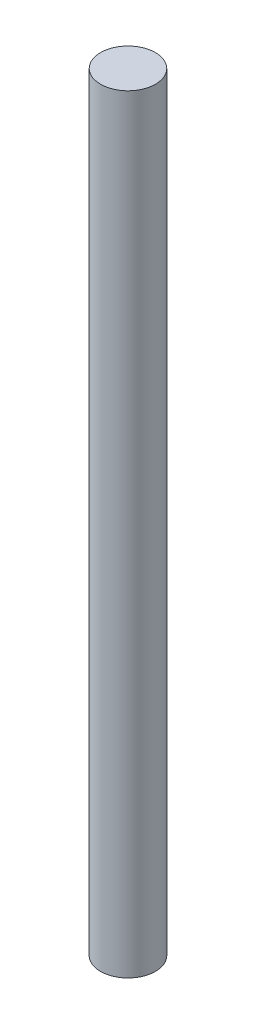
ISO-10303-21;
HEADER;
FILE_DESCRIPTION(('STEP AP214'),'2;1');
FILE_NAME('part.step','',(''),(''),'','','');
FILE_SCHEMA(('AUTOMOTIVE_DESIGN { 1 0 10303 214 1 1 1 1 }'));
ENDSEC;
DATA;
#1=APPLICATION_CONTEXT('core data for automotive mechanical design processes');
#2=APPLICATION_PROTOCOL_DEFINITION('international standard','automotive_design',2000,#1);
#3=PRODUCT_CONTEXT('',#1,'mechanical');
#4=PRODUCT('Part','Part','',(#3));
#5=PRODUCT_RELATED_PRODUCT_CATEGORY('part','',(#4));
#6=PRODUCT_DEFINITION_FORMATION('','',#4);
#7=PRODUCT_DEFINITION_CONTEXT('part definition',#1,'design');
#8=PRODUCT_DEFINITION('design','',#6,#7);
#9=PRODUCT_DEFINITION_SHAPE('','',#8);
#10=(LENGTH_UNIT() NAMED_UNIT(*) SI_UNIT(.MILLI.,.METRE.));
#11=(NAMED_UNIT(*) PLANE_ANGLE_UNIT() SI_UNIT($,.RADIAN.));
#12=(NAMED_UNIT(*) SI_UNIT($,.STERADIAN.) SOLID_ANGLE_UNIT());
#13=UNCERTAINTY_MEASURE_WITH_UNIT(LENGTH_MEASURE(1.E-05),#10,'distance_accuracy_value','');
#14=(GEOMETRIC_REPRESENTATION_CONTEXT(3) GLOBAL_UNCERTAINTY_ASSIGNED_CONTEXT((#13)) GLOBAL_UNIT_ASSIGNED_CONTEXT((#10,
#11,#12)) REPRESENTATION_CONTEXT('',''));
#15=CARTESIAN_POINT('',(0.,0.,0.));
#16=DIRECTION('',(0.,0.,1.));
#17=DIRECTION('',(1.,0.,0.));
#18=AXIS2_PLACEMENT_3D('',#15,#16,#17);
#19=CARTESIAN_POINT('',(0.,44.45,0.));
#20=DIRECTION('',(0.,-1.,0.));
#21=DIRECTION('',(0.,0.,-1.));
#22=AXIS2_PLACEMENT_3D('',#19,#20,#21);
#23=CYLINDRICAL_SURFACE('',#22,1.5875);
#24=CARTESIAN_POINT('',(0.,44.45,0.));
#25=DIRECTION('',(0.,1.,0.));
#26=DIRECTION('',(0.,0.,1.));
#27=AXIS2_PLACEMENT_3D('',#24,#25,#26);
#28=CIRCLE('',#27,1.5875);
#29=CARTESIAN_POINT('',(0.,44.45,1.5875));
#30=VERTEX_POINT('',#29);
#31=EDGE_CURVE('E10',#30,#30,#28,.T.);
#32=ORIENTED_EDGE('',*,*,#31,.F.);
#33=EDGE_LOOP('',(#32));
#34=FACE_BOUND('',#33,.T.);
#35=CARTESIAN_POINT('',(0.,0.,0.));
#36=DIRECTION('',(0.,1.,0.));
#37=DIRECTION('',(0.,0.,1.));
#38=AXIS2_PLACEMENT_3D('',#35,#36,#37);
#39=CIRCLE('',#38,1.5875);
#40=CARTESIAN_POINT('',(0.,0.,1.5875));
#41=VERTEX_POINT('',#40);
#42=EDGE_CURVE('E38',#41,#41,#39,.T.);
#43=ORIENTED_EDGE('',*,*,#42,.T.);
#44=EDGE_LOOP('',(#43));
#45=FACE_BOUND('',#44,.T.);
#46=ADVANCED_FACE('F35',(#34,#45),#23,.T.);
#47=CARTESIAN_POINT('',(0.,44.45,0.));
#48=DIRECTION('',(0.,1.,0.));
#49=DIRECTION('',(0.,0.,1.));
#50=AXIS2_PLACEMENT_3D('',#47,#48,#49);
#51=PLANE('',#50);
#52=ORIENTED_EDGE('',*,*,#31,.T.);
#53=EDGE_LOOP('',(#52));
#54=FACE_BOUND('',#53,.T.);
#55=ADVANCED_FACE('F50',(#54),#51,.T.);
#56=CARTESIAN_POINT('',(0.,0.,0.));
#57=DIRECTION('',(0.,1.,0.));
#58=DIRECTION('',(0.,0.,1.));
#59=AXIS2_PLACEMENT_3D('',#56,#57,#58);
#60=PLANE('',#59);
#61=ORIENTED_EDGE('',*,*,#42,.F.);
#62=EDGE_LOOP('',(#61));
#63=FACE_BOUND('',#62,.T.);
#64=ADVANCED_FACE('F48',(#63),#60,.F.);
#65=CLOSED_SHELL('',(#46,#55,#64));
#66=MANIFOLD_SOLID_BREP('B2',#65);
#67=ADVANCED_BREP_SHAPE_REPRESENTATION('',(#18,#66),#14);
#68=SHAPE_DEFINITION_REPRESENTATION(#9,#67);
ENDSEC;
END-ISO-10303-21;
